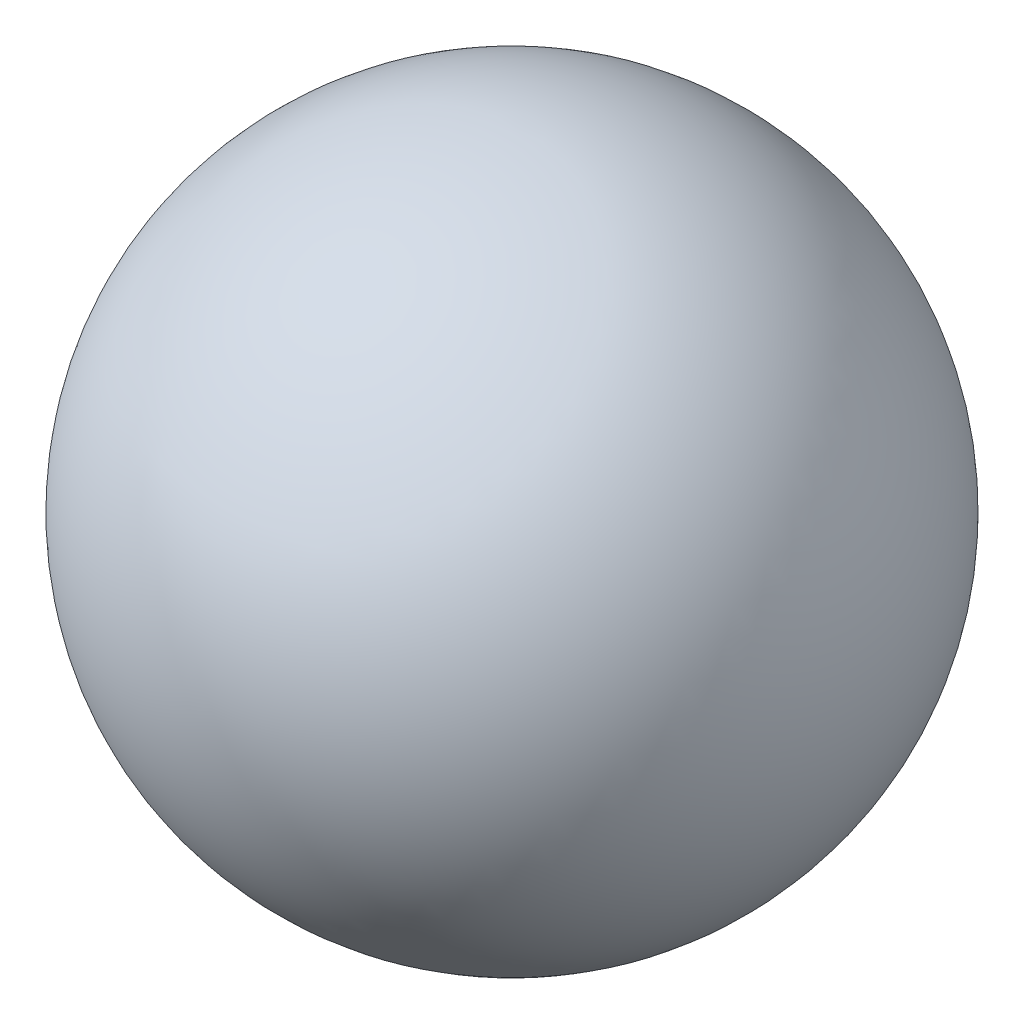
ISO-10303-21;
HEADER;
FILE_DESCRIPTION(('STEP AP214'),'2;1');
FILE_NAME('part.step','',(''),(''),'','','');
FILE_SCHEMA(('AUTOMOTIVE_DESIGN { 1 0 10303 214 1 1 1 1 }'));
ENDSEC;
DATA;
#1=APPLICATION_CONTEXT('core data for automotive mechanical design processes');
#2=APPLICATION_PROTOCOL_DEFINITION('international standard','automotive_design',2000,#1);
#3=PRODUCT_CONTEXT('',#1,'mechanical');
#4=PRODUCT('Part','Part','',(#3));
#5=PRODUCT_RELATED_PRODUCT_CATEGORY('part','',(#4));
#6=PRODUCT_DEFINITION_FORMATION('','',#4);
#7=PRODUCT_DEFINITION_CONTEXT('part definition',#1,'design');
#8=PRODUCT_DEFINITION('design','',#6,#7);
#9=PRODUCT_DEFINITION_SHAPE('','',#8);
#10=(LENGTH_UNIT() NAMED_UNIT(*) SI_UNIT(.MILLI.,.METRE.));
#11=(NAMED_UNIT(*) PLANE_ANGLE_UNIT() SI_UNIT($,.RADIAN.));
#12=(NAMED_UNIT(*) SI_UNIT($,.STERADIAN.) SOLID_ANGLE_UNIT());
#13=UNCERTAINTY_MEASURE_WITH_UNIT(LENGTH_MEASURE(1.E-05),#10,'distance_accuracy_value','');
#14=(GEOMETRIC_REPRESENTATION_CONTEXT(3) GLOBAL_UNCERTAINTY_ASSIGNED_CONTEXT((#13)) GLOBAL_UNIT_ASSIGNED_CONTEXT((#10,
#11,#12)) REPRESENTATION_CONTEXT('',''));
#15=CARTESIAN_POINT('',(0.,0.,0.));
#16=DIRECTION('',(0.,0.,1.));
#17=DIRECTION('',(1.,0.,0.));
#18=AXIS2_PLACEMENT_3D('',#15,#16,#17);
#19=CARTESIAN_POINT('',(0.,0.,0.));
#20=DIRECTION('',(0.,-1.,0.));
#21=DIRECTION('',(-1.,0.,0.));
#22=AXIS2_PLACEMENT_3D('',#19,#20,#21);
#23=SPHERICAL_SURFACE('',#22,20.);
#24=CARTESIAN_POINT('',(0.,-19.0787840283389,0.));
#25=DIRECTION('',(0.,1.,0.));
#26=DIRECTION('',(0.,0.,1.));
#27=AXIS2_PLACEMENT_3D('',#24,#25,#26);
#28=CIRCLE('',#27,6.);
#29=CARTESIAN_POINT('',(0.,-19.0787840283389,6.));
#30=VERTEX_POINT('',#29);
#31=EDGE_CURVE('E10',#30,#30,#28,.F.);
#32=ORIENTED_EDGE('',*,*,#31,.F.);
#33=EDGE_LOOP('',(#32));
#34=FACE_BOUND('',#33,.T.);
#35=ADVANCED_FACE('F33',(#34),#23,.T.);
#36=CARTESIAN_POINT('',(0.,-25.,0.));
#37=DIRECTION('',(0.,1.,0.));
#38=DIRECTION('',(0.,0.,1.));
#39=AXIS2_PLACEMENT_3D('',#36,#37,#38);
#40=CYLINDRICAL_SURFACE('',#39,6.);
#41=ORIENTED_EDGE('',*,*,#31,.T.);
#42=EDGE_LOOP('',(#41));
#43=FACE_BOUND('',#42,.T.);
#44=CARTESIAN_POINT('',(0.,0.,0.));
#45=DIRECTION('',(0.,1.,0.));
#46=DIRECTION('',(0.,0.,1.));
#47=AXIS2_PLACEMENT_3D('',#44,#45,#46);
#48=CIRCLE('',#47,6.);
#49=CARTESIAN_POINT('',(0.,0.,6.));
#50=VERTEX_POINT('',#49);
#51=EDGE_CURVE('E39',#50,#50,#48,.T.);
#52=ORIENTED_EDGE('',*,*,#51,.T.);
#53=EDGE_LOOP('',(#52));
#54=FACE_BOUND('',#53,.T.);
#55=ADVANCED_FACE('F45',(#43,#54),#40,.F.);
#56=CARTESIAN_POINT('',(0.,0.,0.));
#57=DIRECTION('',(0.,1.,0.));
#58=DIRECTION('',(0.,0.,1.));
#59=AXIS2_PLACEMENT_3D('',#56,#57,#58);
#60=PLANE('',#59);
#61=ORIENTED_EDGE('',*,*,#51,.F.);
#62=EDGE_LOOP('',(#61));
#63=FACE_BOUND('',#62,.T.);
#64=ADVANCED_FACE('F47',(#63),#60,.F.);
#65=CLOSED_SHELL('',(#35,#55,#64));
#66=MANIFOLD_SOLID_BREP('B2',#65);
#67=ADVANCED_BREP_SHAPE_REPRESENTATION('',(#18,#66),#14);
#68=SHAPE_DEFINITION_REPRESENTATION(#9,#67);
ENDSEC;
END-ISO-10303-21;
